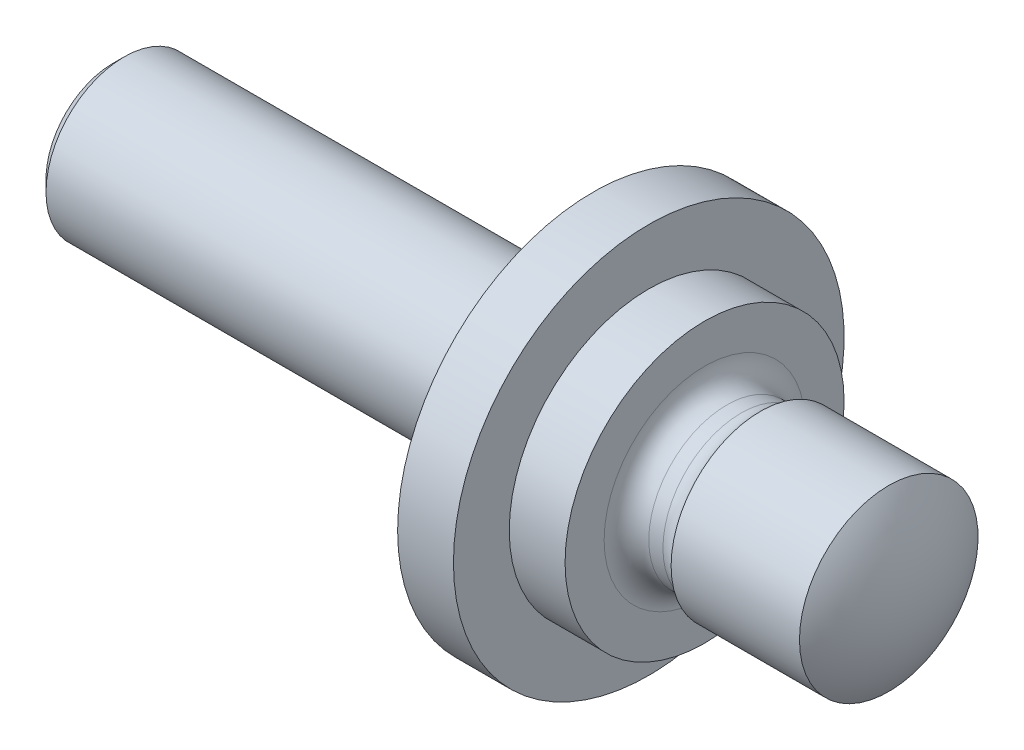
ISO-10303-21;
HEADER;
FILE_DESCRIPTION(('STEP AP214'),'2;1');
FILE_NAME('part.step','',(''),(''),'','','');
FILE_SCHEMA(('AUTOMOTIVE_DESIGN { 1 0 10303 214 1 1 1 1 }'));
ENDSEC;
DATA;
#1=APPLICATION_CONTEXT('core data for automotive mechanical design processes');
#2=APPLICATION_PROTOCOL_DEFINITION('international standard','automotive_design',2000,#1);
#3=PRODUCT_CONTEXT('',#1,'mechanical');
#4=PRODUCT('Part','Part','',(#3));
#5=PRODUCT_RELATED_PRODUCT_CATEGORY('part','',(#4));
#6=PRODUCT_DEFINITION_FORMATION('','',#4);
#7=PRODUCT_DEFINITION_CONTEXT('part definition',#1,'design');
#8=PRODUCT_DEFINITION('design','',#6,#7);
#9=PRODUCT_DEFINITION_SHAPE('','',#8);
#10=(LENGTH_UNIT() NAMED_UNIT(*) SI_UNIT(.MILLI.,.METRE.));
#11=(NAMED_UNIT(*) PLANE_ANGLE_UNIT() SI_UNIT($,.RADIAN.));
#12=(NAMED_UNIT(*) SI_UNIT($,.STERADIAN.) SOLID_ANGLE_UNIT());
#13=UNCERTAINTY_MEASURE_WITH_UNIT(LENGTH_MEASURE(1.E-05),#10,'distance_accuracy_value','');
#14=(GEOMETRIC_REPRESENTATION_CONTEXT(3) GLOBAL_UNCERTAINTY_ASSIGNED_CONTEXT((#13)) GLOBAL_UNIT_ASSIGNED_CONTEXT((#10,
#11,#12)) REPRESENTATION_CONTEXT('',''));
#15=CARTESIAN_POINT('',(0.,0.,0.));
#16=DIRECTION('',(0.,0.,1.));
#17=DIRECTION('',(1.,0.,0.));
#18=AXIS2_PLACEMENT_3D('',#15,#16,#17);
#19=CARTESIAN_POINT('',(0.,0.,0.));
#20=DIRECTION('',(1.,0.,0.));
#21=DIRECTION('',(0.,0.,-1.));
#22=AXIS2_PLACEMENT_3D('',#19,#20,#21);
#23=PLANE('',#22);
#24=CARTESIAN_POINT('',(0.,0.,0.));
#25=DIRECTION('',(1.,0.,0.));
#26=DIRECTION('',(0.,0.,-1.));
#27=AXIS2_PLACEMENT_3D('',#24,#25,#26);
#28=CIRCLE('',#27,5.99999999999998);
#29=CARTESIAN_POINT('',(0.,0.,-5.99999999999998));
#30=VERTEX_POINT('',#29);
#31=EDGE_CURVE('E58',#30,#30,#28,.F.);
#32=ORIENTED_EDGE('',*,*,#31,.T.);
#33=EDGE_LOOP('',(#32));
#34=FACE_BOUND('',#33,.T.);
#35=ADVANCED_FACE('F51',(#34),#23,.F.);
#36=CARTESIAN_POINT('',(0.,0.,0.));
#37=DIRECTION('',(-1.,0.,0.));
#38=DIRECTION('',(0.,0.,1.));
#39=AXIS2_PLACEMENT_3D('',#36,#37,#38);
#40=CYLINDRICAL_SURFACE('',#39,7.);
#41=CARTESIAN_POINT('',(1.00000000000001,0.,0.));
#42=DIRECTION('',(1.,0.,0.));
#43=DIRECTION('',(0.,0.,-1.));
#44=AXIS2_PLACEMENT_3D('',#41,#42,#43);
#45=CIRCLE('',#44,7.);
#46=CARTESIAN_POINT('',(1.00000000000001,0.,-7.));
#47=VERTEX_POINT('',#46);
#48=EDGE_CURVE('E11',#47,#47,#45,.T.);
#49=ORIENTED_EDGE('',*,*,#48,.T.);
#50=EDGE_LOOP('',(#49));
#51=FACE_BOUND('',#50,.T.);
#52=CARTESIAN_POINT('',(43.,0.,0.));
#53=DIRECTION('',(-1.,0.,0.));
#54=DIRECTION('',(0.,0.,1.));
#55=AXIS2_PLACEMENT_3D('',#52,#53,#54);
#56=CIRCLE('',#55,7.);
#57=CARTESIAN_POINT('',(43.,0.,7.));
#58=VERTEX_POINT('',#57);
#59=EDGE_CURVE('E94',#58,#58,#56,.T.);
#60=ORIENTED_EDGE('',*,*,#59,.T.);
#61=EDGE_LOOP('',(#60));
#62=FACE_BOUND('',#61,.T.);
#63=ADVANCED_FACE('F127',(#51,#62),#40,.T.);
#64=CARTESIAN_POINT('',(43.,17.5,0.));
#65=DIRECTION('',(1.,0.,0.));
#66=DIRECTION('',(0.,0.,-1.));
#67=AXIS2_PLACEMENT_3D('',#64,#65,#66);
#68=PLANE('',#67);
#69=ORIENTED_EDGE('',*,*,#59,.F.);
#70=EDGE_LOOP('',(#69));
#71=FACE_BOUND('',#70,.T.);
#72=CARTESIAN_POINT('',(43.,0.,0.));
#73=DIRECTION('',(-1.,0.,0.));
#74=DIRECTION('',(0.,0.,1.));
#75=AXIS2_PLACEMENT_3D('',#72,#73,#74);
#76=CIRCLE('',#75,17.5);
#77=CARTESIAN_POINT('',(43.,0.,17.5));
#78=VERTEX_POINT('',#77);
#79=EDGE_CURVE('E89',#78,#78,#76,.T.);
#80=ORIENTED_EDGE('',*,*,#79,.T.);
#81=EDGE_LOOP('',(#80));
#82=FACE_BOUND('',#81,.T.);
#83=ADVANCED_FACE('F131',(#71,#82),#68,.F.);
#84=CARTESIAN_POINT('',(0.,0.,0.));
#85=DIRECTION('',(-1.,0.,0.));
#86=DIRECTION('',(0.,0.,1.));
#87=AXIS2_PLACEMENT_3D('',#84,#85,#86);
#88=CYLINDRICAL_SURFACE('',#87,17.5);
#89=ORIENTED_EDGE('',*,*,#79,.F.);
#90=EDGE_LOOP('',(#89));
#91=FACE_BOUND('',#90,.T.);
#92=CARTESIAN_POINT('',(48.,0.,0.));
#93=DIRECTION('',(-1.,0.,0.));
#94=DIRECTION('',(0.,0.,1.));
#95=AXIS2_PLACEMENT_3D('',#92,#93,#94);
#96=CIRCLE('',#95,17.5);
#97=CARTESIAN_POINT('',(48.,0.,17.5));
#98=VERTEX_POINT('',#97);
#99=EDGE_CURVE('E88',#98,#98,#96,.T.);
#100=ORIENTED_EDGE('',*,*,#99,.T.);
#101=EDGE_LOOP('',(#100));
#102=FACE_BOUND('',#101,.T.);
#103=ADVANCED_FACE('F166',(#91,#102),#88,.T.);
#104=CARTESIAN_POINT('',(48.,12.5,0.));
#105=DIRECTION('',(-1.,0.,0.));
#106=DIRECTION('',(0.,0.,1.));
#107=AXIS2_PLACEMENT_3D('',#104,#105,#106);
#108=PLANE('',#107);
#109=ORIENTED_EDGE('',*,*,#99,.F.);
#110=EDGE_LOOP('',(#109));
#111=FACE_BOUND('',#110,.T.);
#112=CARTESIAN_POINT('',(48.,0.,0.));
#113=DIRECTION('',(-1.,0.,0.));
#114=DIRECTION('',(0.,0.,1.));
#115=AXIS2_PLACEMENT_3D('',#112,#113,#114);
#116=CIRCLE('',#115,12.5);
#117=CARTESIAN_POINT('',(48.,0.,12.5));
#118=VERTEX_POINT('',#117);
#119=EDGE_CURVE('E84',#118,#118,#116,.T.);
#120=ORIENTED_EDGE('',*,*,#119,.T.);
#121=EDGE_LOOP('',(#120));
#122=FACE_BOUND('',#121,.T.);
#123=ADVANCED_FACE('F162',(#111,#122),#108,.F.);
#124=CARTESIAN_POINT('',(0.,0.,0.));
#125=DIRECTION('',(-1.,0.,0.));
#126=DIRECTION('',(0.,0.,1.));
#127=AXIS2_PLACEMENT_3D('',#124,#125,#126);
#128=CYLINDRICAL_SURFACE('',#127,12.5);
#129=ORIENTED_EDGE('',*,*,#119,.F.);
#130=EDGE_LOOP('',(#129));
#131=FACE_BOUND('',#130,.T.);
#132=CARTESIAN_POINT('',(53.,0.,0.));
#133=DIRECTION('',(-1.,0.,0.));
#134=DIRECTION('',(0.,0.,1.));
#135=AXIS2_PLACEMENT_3D('',#132,#133,#134);
#136=CIRCLE('',#135,12.5);
#137=CARTESIAN_POINT('',(53.,0.,12.5));
#138=VERTEX_POINT('',#137);
#139=EDGE_CURVE('E76',#138,#138,#136,.T.);
#140=ORIENTED_EDGE('',*,*,#139,.T.);
#141=EDGE_LOOP('',(#140));
#142=FACE_BOUND('',#141,.T.);
#143=ADVANCED_FACE('F158',(#131,#142),#128,.T.);
#144=CARTESIAN_POINT('',(53.,12.5,0.));
#145=DIRECTION('',(-1.,0.,0.));
#146=DIRECTION('',(0.,0.,1.));
#147=AXIS2_PLACEMENT_3D('',#144,#145,#146);
#148=PLANE('',#147);
#149=CARTESIAN_POINT('',(53.,0.,0.));
#150=DIRECTION('',(-1.,0.,0.));
#151=DIRECTION('',(0.,0.,1.));
#152=AXIS2_PLACEMENT_3D('',#149,#150,#151);
#153=CIRCLE('',#152,9.);
#154=CARTESIAN_POINT('',(53.,0.,9.));
#155=VERTEX_POINT('',#154);
#156=EDGE_CURVE('E106',#155,#155,#153,.T.);
#157=ORIENTED_EDGE('',*,*,#156,.T.);
#158=EDGE_LOOP('',(#157));
#159=FACE_BOUND('',#158,.T.);
#160=ORIENTED_EDGE('',*,*,#139,.F.);
#161=EDGE_LOOP('',(#160));
#162=FACE_BOUND('',#161,.T.);
#163=ADVANCED_FACE('F147',(#159,#162),#148,.F.);
#164=CARTESIAN_POINT('',(0.,0.,0.));
#165=DIRECTION('',(-1.,0.,0.));
#166=DIRECTION('',(0.,0.,1.));
#167=AXIS2_PLACEMENT_3D('',#164,#165,#166);
#168=CYLINDRICAL_SURFACE('',#167,7.);
#169=CARTESIAN_POINT('',(56.2679491924311,0.,0.));
#170=DIRECTION('',(1.,0.,0.));
#171=DIRECTION('',(0.,0.,-1.));
#172=AXIS2_PLACEMENT_3D('',#169,#170,#171);
#173=CIRCLE('',#172,7.);
#174=CARTESIAN_POINT('',(56.2679491924311,0.,-7.));
#175=VERTEX_POINT('',#174);
#176=EDGE_CURVE('E105',#175,#175,#173,.F.);
#177=ORIENTED_EDGE('',*,*,#176,.T.);
#178=EDGE_LOOP('',(#177));
#179=FACE_BOUND('',#178,.T.);
#180=CARTESIAN_POINT('',(55.,0.,0.));
#181=DIRECTION('',(-1.,0.,0.));
#182=DIRECTION('',(0.,0.,1.));
#183=AXIS2_PLACEMENT_3D('',#180,#181,#182);
#184=CIRCLE('',#183,7.);
#185=CARTESIAN_POINT('',(55.,0.,7.));
#186=VERTEX_POINT('',#185);
#187=EDGE_CURVE('E98',#186,#186,#184,.F.);
#188=ORIENTED_EDGE('',*,*,#187,.T.);
#189=EDGE_LOOP('',(#188));
#190=FACE_BOUND('',#189,.T.);
#191=ADVANCED_FACE('F141',(#179,#190),#168,.T.);
#192=CARTESIAN_POINT('',(0.,0.,0.));
#193=DIRECTION('',(-1.,0.,0.));
#194=DIRECTION('',(0.,0.,1.));
#195=AXIS2_PLACEMENT_3D('',#192,#193,#194);
#196=CYLINDRICAL_SURFACE('',#195,8.);
#197=CARTESIAN_POINT('',(69.5,0.,0.));
#198=DIRECTION('',(1.,0.,0.));
#199=DIRECTION('',(0.,1.,0.));
#200=AXIS2_PLACEMENT_3D('',#197,#198,#199);
#201=CIRCLE('',#200,8.);
#202=CARTESIAN_POINT('',(69.5,8.,0.));
#203=VERTEX_POINT('',#202);
#204=EDGE_CURVE('E66',#203,#203,#201,.T.);
#205=ORIENTED_EDGE('',*,*,#204,.F.);
#206=EDGE_LOOP('',(#205));
#207=FACE_BOUND('',#206,.T.);
#208=CARTESIAN_POINT('',(58.,0.,0.));
#209=DIRECTION('',(-1.,0.,0.));
#210=DIRECTION('',(0.,0.,1.));
#211=AXIS2_PLACEMENT_3D('',#208,#209,#210);
#212=CIRCLE('',#211,8.);
#213=CARTESIAN_POINT('',(58.,0.,8.));
#214=VERTEX_POINT('',#213);
#215=EDGE_CURVE('E75',#214,#214,#212,.T.);
#216=ORIENTED_EDGE('',*,*,#215,.F.);
#217=EDGE_LOOP('',(#216));
#218=FACE_BOUND('',#217,.T.);
#219=ADVANCED_FACE('F139',(#207,#218),#196,.T.);
#220=CARTESIAN_POINT('',(56.2679491924311,0.,0.));
#221=DIRECTION('',(1.,0.,0.));
#222=DIRECTION('',(0.,0.,-1.));
#223=AXIS2_PLACEMENT_3D('',#220,#221,#222);
#224=TOROIDAL_SURFACE('',#223,9.,2.);
#225=ORIENTED_EDGE('',*,*,#215,.T.);
#226=EDGE_LOOP('',(#225));
#227=FACE_BOUND('',#226,.T.);
#228=ORIENTED_EDGE('',*,*,#176,.F.);
#229=EDGE_LOOP('',(#228));
#230=FACE_BOUND('',#229,.T.);
#231=ADVANCED_FACE('F124',(#227,#230),#224,.F.);
#232=CARTESIAN_POINT('',(55.,0.,0.));
#233=DIRECTION('',(-1.,0.,0.));
#234=DIRECTION('',(0.,0.,1.));
#235=AXIS2_PLACEMENT_3D('',#232,#233,#234);
#236=TOROIDAL_SURFACE('',#235,9.,2.);
#237=ORIENTED_EDGE('',*,*,#187,.F.);
#238=EDGE_LOOP('',(#237));
#239=FACE_BOUND('',#238,.T.);
#240=ORIENTED_EDGE('',*,*,#156,.F.);
#241=EDGE_LOOP('',(#240));
#242=FACE_BOUND('',#241,.T.);
#243=ADVANCED_FACE('F113',(#239,#242),#236,.F.);
#244=CARTESIAN_POINT('',(0.,0.,0.));
#245=DIRECTION('',(1.,0.,0.));
#246=DIRECTION('',(0.,0.,-1.));
#247=AXIS2_PLACEMENT_3D('',#244,#245,#246);
#248=CONICAL_SURFACE('',#247,5.99999999999998,0.785398163397457);
#249=ORIENTED_EDGE('',*,*,#48,.F.);
#250=EDGE_LOOP('',(#249));
#251=FACE_BOUND('',#250,.T.);
#252=ORIENTED_EDGE('',*,*,#31,.F.);
#253=EDGE_LOOP('',(#252));
#254=FACE_BOUND('',#253,.T.);
#255=ADVANCED_FACE('F53',(#251,#254),#248,.T.);
#256=CARTESIAN_POINT('',(57.95,0.,0.));
#257=DIRECTION('',(1.,0.,0.));
#258=DIRECTION('',(0.,1.,0.));
#259=AXIS2_PLACEMENT_3D('',#256,#257,#258);
#260=SPHERICAL_SURFACE('',#259,14.05);
#261=CARTESIAN_POINT('',(72.,0.,0.));
#262=VERTEX_POINT('',#261);
#263=VERTEX_LOOP('',#262);
#264=FACE_BOUND('',#263,.T.);
#265=ORIENTED_EDGE('',*,*,#204,.T.);
#266=EDGE_LOOP('',(#265));
#267=FACE_BOUND('',#266,.T.);
#268=ADVANCED_FACE('F64',(#264,#267),#260,.T.);
#269=CLOSED_SHELL('',(#35,#63,#83,#103,#123,#143,#163,#191,#219,#231,#243,#255,#268));
#270=MANIFOLD_SOLID_BREP('B2',#269);
#271=ADVANCED_BREP_SHAPE_REPRESENTATION('',(#18,#270),#14);
#272=SHAPE_DEFINITION_REPRESENTATION(#9,#271);
ENDSEC;
END-ISO-10303-21;
